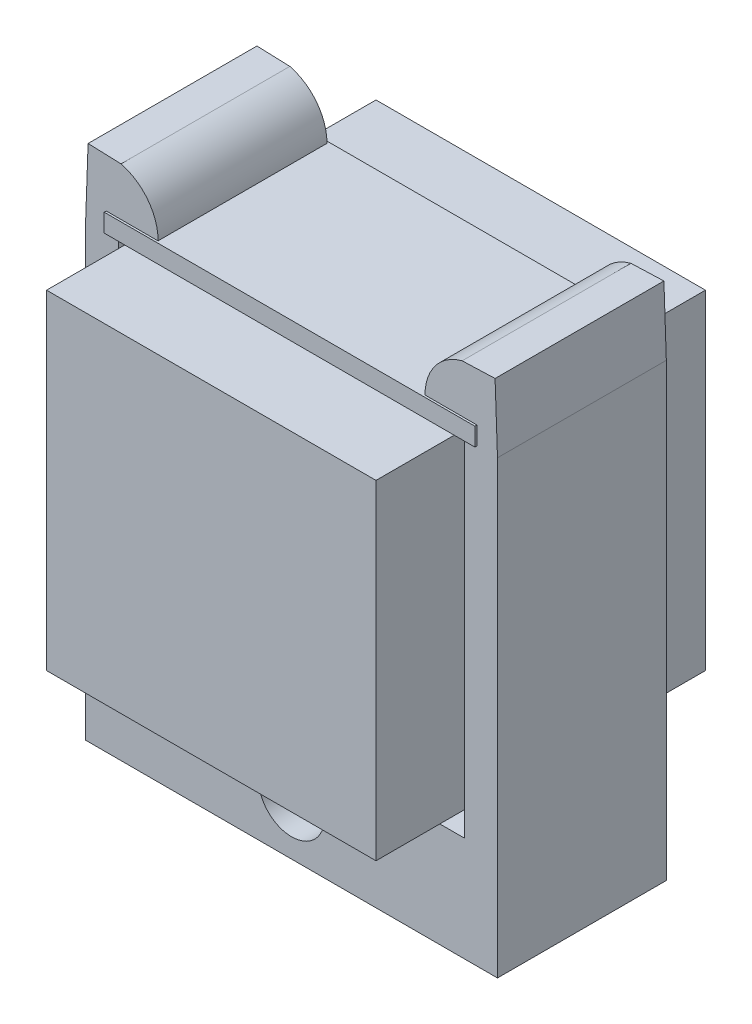
ISO-10303-21;
HEADER;
FILE_DESCRIPTION(('STEP AP214'),'2;1');
FILE_NAME('part.step','',(''),(''),'','','');
FILE_SCHEMA(('AUTOMOTIVE_DESIGN { 1 0 10303 214 1 1 1 1 }'));
ENDSEC;
DATA;
#1=APPLICATION_CONTEXT('core data for automotive mechanical design processes');
#2=APPLICATION_PROTOCOL_DEFINITION('international standard','automotive_design',2000,#1);
#3=PRODUCT_CONTEXT('',#1,'mechanical');
#4=PRODUCT('Part','Part','',(#3));
#5=PRODUCT_RELATED_PRODUCT_CATEGORY('part','',(#4));
#6=PRODUCT_DEFINITION_FORMATION('','',#4);
#7=PRODUCT_DEFINITION_CONTEXT('part definition',#1,'design');
#8=PRODUCT_DEFINITION('design','',#6,#7);
#9=PRODUCT_DEFINITION_SHAPE('','',#8);
#10=(LENGTH_UNIT() NAMED_UNIT(*) SI_UNIT(.MILLI.,.METRE.));
#11=(NAMED_UNIT(*) PLANE_ANGLE_UNIT() SI_UNIT($,.RADIAN.));
#12=(NAMED_UNIT(*) SI_UNIT($,.STERADIAN.) SOLID_ANGLE_UNIT());
#13=UNCERTAINTY_MEASURE_WITH_UNIT(LENGTH_MEASURE(1.E-05),#10,'distance_accuracy_value','');
#14=(GEOMETRIC_REPRESENTATION_CONTEXT(3) GLOBAL_UNCERTAINTY_ASSIGNED_CONTEXT((#13)) GLOBAL_UNIT_ASSIGNED_CONTEXT((#10,
#11,#12)) REPRESENTATION_CONTEXT('',''));
#15=CARTESIAN_POINT('',(0.,0.,0.));
#16=DIRECTION('',(0.,0.,1.));
#17=DIRECTION('',(1.,0.,0.));
#18=AXIS2_PLACEMENT_3D('',#15,#16,#17);
#19=CARTESIAN_POINT('',(-22.2024484903669,2.24434720304654,10.25));
#20=DIRECTION('',(0.,0.,-1.));
#21=DIRECTION('',(-1.,0.,0.));
#22=AXIS2_PLACEMENT_3D('',#19,#20,#21);
#23=CYLINDRICAL_SURFACE('',#22,5.99639103243552);
#24=CARTESIAN_POINT('',(-22.2024484903669,2.24434720304654,-10.25));
#25=DIRECTION('',(0.,0.,1.));
#26=DIRECTION('',(1.,0.,0.));
#27=AXIS2_PLACEMENT_3D('',#24,#25,#26);
#28=CIRCLE('',#27,5.99639103243552);
#29=CARTESIAN_POINT('',(-20.709878032408,8.05200928360027,-10.25));
#30=VERTEX_POINT('',#29);
#31=CARTESIAN_POINT('',(-16.209878032408,2.03032682954803,-10.25));
#32=VERTEX_POINT('',#31);
#33=EDGE_CURVE('E200',#30,#32,#28,.F.);
#34=ORIENTED_EDGE('',*,*,#33,.F.);
#35=DIRECTION('',(0.,0.,-1.));
#36=VECTOR('',#35,1.);
#37=CARTESIAN_POINT('',(-20.709878032408,8.05200928360027,10.25));
#38=LINE('',#37,#36);
#39=CARTESIAN_POINT('',(-20.709878032408,8.05200928360027,10.25));
#40=VERTEX_POINT('',#39);
#41=EDGE_CURVE('E12',#40,#30,#38,.T.);
#42=ORIENTED_EDGE('',*,*,#41,.F.);
#43=CARTESIAN_POINT('',(-22.2024484903669,2.24434720304654,10.25));
#44=DIRECTION('',(0.,0.,1.));
#45=DIRECTION('',(1.,0.,0.));
#46=AXIS2_PLACEMENT_3D('',#43,#44,#45);
#47=CIRCLE('',#46,5.99639103243552);
#48=CARTESIAN_POINT('',(-16.209878032408,2.03032682954803,10.25));
#49=VERTEX_POINT('',#48);
#50=EDGE_CURVE('E243',#40,#49,#47,.F.);
#51=ORIENTED_EDGE('',*,*,#50,.T.);
#52=DIRECTION('',(0.,0.,-1.));
#53=VECTOR('',#52,1.);
#54=CARTESIAN_POINT('',(-16.209878032408,2.03032682954803,10.25));
#55=LINE('',#54,#53);
#56=EDGE_CURVE('E71',#49,#32,#55,.T.);
#57=ORIENTED_EDGE('',*,*,#56,.T.);
#58=EDGE_LOOP('',(#34,#42,#51,#57));
#59=FACE_BOUND('',#58,.T.);
#60=ADVANCED_FACE('F55',(#59),#23,.T.);
#61=CARTESIAN_POINT('',(0.260823416443797,7.30305566042707,10.25));
#62=DIRECTION('',(0.0356915305124088,0.99936285434755,0.));
#63=DIRECTION('',(-0.99936285434755,0.0356915305124088,0.));
#64=AXIS2_PLACEMENT_3D('',#61,#62,#63);
#65=PLANE('',#64);
#66=DIRECTION('',(0.99936285434755,-0.0356915305124088,0.));
#67=VECTOR('',#66,1.);
#68=CARTESIAN_POINT('',(0.260823416443797,7.30305566042707,-10.25));
#69=LINE('',#68,#67);
#70=CARTESIAN_POINT('',(-24.7073294497982,8.19477540564991,-10.25));
#71=VERTEX_POINT('',#70);
#72=EDGE_CURVE('E202',#71,#30,#69,.T.);
#73=ORIENTED_EDGE('',*,*,#72,.F.);
#74=DIRECTION('',(0.,0.,-1.));
#75=VECTOR('',#74,1.);
#76=CARTESIAN_POINT('',(-24.7073294497982,8.19477540564991,10.25));
#77=LINE('',#76,#75);
#78=CARTESIAN_POINT('',(-24.7073294497982,8.19477540564991,10.25));
#79=VERTEX_POINT('',#78);
#80=EDGE_CURVE('E63',#79,#71,#77,.T.);
#81=ORIENTED_EDGE('',*,*,#80,.F.);
#82=DIRECTION('',(0.99936285434755,-0.0356915305124088,0.));
#83=VECTOR('',#82,1.);
#84=CARTESIAN_POINT('',(0.260823416443797,7.30305566042707,10.25));
#85=LINE('',#84,#83);
#86=EDGE_CURVE('E294',#79,#40,#85,.T.);
#87=ORIENTED_EDGE('',*,*,#86,.T.);
#88=ORIENTED_EDGE('',*,*,#41,.T.);
#89=EDGE_LOOP('',(#73,#81,#87,#88));
#90=FACE_BOUND('',#89,.T.);
#91=ADVANCED_FACE('F280',(#90),#65,.T.);
#92=CARTESIAN_POINT('',(-24.968152866242,0.891719745222844,10.25));
#93=DIRECTION('',(-0.99936285434755,0.035691530512409,0.));
#94=DIRECTION('',(-0.035691530512409,-0.99936285434755,0.));
#95=AXIS2_PLACEMENT_3D('',#92,#93,#94);
#96=PLANE('',#95);
#97=DIRECTION('',(0.035691530512409,0.99936285434755,0.));
#98=VECTOR('',#97,1.);
#99=CARTESIAN_POINT('',(-24.968152866242,0.891719745222844,-10.25));
#100=LINE('',#99,#98);
#101=CARTESIAN_POINT('',(-25.,0.,-10.25));
#102=VERTEX_POINT('',#101);
#103=EDGE_CURVE('E205',#102,#71,#100,.T.);
#104=ORIENTED_EDGE('',*,*,#103,.F.);
#105=DIRECTION('',(0.,0.,-1.));
#106=VECTOR('',#105,1.);
#107=CARTESIAN_POINT('',(-25.,0.,10.25));
#108=LINE('',#107,#106);
#109=CARTESIAN_POINT('',(-25.,0.,10.25));
#110=VERTEX_POINT('',#109);
#111=EDGE_CURVE('E269',#110,#102,#108,.T.);
#112=ORIENTED_EDGE('',*,*,#111,.F.);
#113=DIRECTION('',(0.035691530512409,0.99936285434755,0.));
#114=VECTOR('',#113,1.);
#115=CARTESIAN_POINT('',(-24.968152866242,0.891719745222844,10.25));
#116=LINE('',#115,#114);
#117=EDGE_CURVE('E276',#110,#79,#116,.T.);
#118=ORIENTED_EDGE('',*,*,#117,.T.);
#119=ORIENTED_EDGE('',*,*,#80,.T.);
#120=EDGE_LOOP('',(#104,#112,#118,#119));
#121=FACE_BOUND('',#120,.T.);
#122=ADVANCED_FACE('F274',(#121),#96,.T.);
#123=CARTESIAN_POINT('',(-25.,0.,10.25));
#124=DIRECTION('',(-1.,0.,0.));
#125=DIRECTION('',(0.,0.,1.));
#126=AXIS2_PLACEMENT_3D('',#123,#124,#125);
#127=PLANE('',#126);
#128=DIRECTION('',(0.,1.,0.));
#129=VECTOR('',#128,1.);
#130=CARTESIAN_POINT('',(-25.,0.,-10.25));
#131=LINE('',#130,#129);
#132=CARTESIAN_POINT('',(-25.,-54.7,-10.25));
#133=VERTEX_POINT('',#132);
#134=EDGE_CURVE('E208',#133,#102,#131,.T.);
#135=ORIENTED_EDGE('',*,*,#134,.F.);
#136=DIRECTION('',(0.,0.,-1.));
#137=VECTOR('',#136,1.);
#138=CARTESIAN_POINT('',(-25.,-54.7,10.25));
#139=LINE('',#138,#137);
#140=CARTESIAN_POINT('',(-25.,-54.7,10.25));
#141=VERTEX_POINT('',#140);
#142=EDGE_CURVE('E267',#141,#133,#139,.T.);
#143=ORIENTED_EDGE('',*,*,#142,.F.);
#144=DIRECTION('',(0.,1.,0.));
#145=VECTOR('',#144,1.);
#146=CARTESIAN_POINT('',(-25.,0.,10.25));
#147=LINE('',#146,#145);
#148=EDGE_CURVE('E291',#141,#110,#147,.T.);
#149=ORIENTED_EDGE('',*,*,#148,.T.);
#150=ORIENTED_EDGE('',*,*,#111,.T.);
#151=EDGE_LOOP('',(#135,#143,#149,#150));
#152=FACE_BOUND('',#151,.T.);
#153=ADVANCED_FACE('F288',(#152),#127,.T.);
#154=CARTESIAN_POINT('',(0.,-54.7,10.25));
#155=DIRECTION('',(0.,-1.,0.));
#156=DIRECTION('',(0.,0.,-1.));
#157=AXIS2_PLACEMENT_3D('',#154,#155,#156);
#158=PLANE('',#157);
#159=DIRECTION('',(-1.,0.,0.));
#160=VECTOR('',#159,1.);
#161=CARTESIAN_POINT('',(0.,-54.7,-10.25));
#162=LINE('',#161,#160);
#163=CARTESIAN_POINT('',(25.,-54.7,-10.25));
#164=VERTEX_POINT('',#163);
#165=EDGE_CURVE('E211',#164,#133,#162,.T.);
#166=ORIENTED_EDGE('',*,*,#165,.F.);
#167=DIRECTION('',(0.,0.,-1.));
#168=VECTOR('',#167,1.);
#169=CARTESIAN_POINT('',(25.,-54.7,10.25));
#170=LINE('',#169,#168);
#171=CARTESIAN_POINT('',(25.,-54.7,10.25));
#172=VERTEX_POINT('',#171);
#173=EDGE_CURVE('E265',#172,#164,#170,.T.);
#174=ORIENTED_EDGE('',*,*,#173,.F.);
#175=DIRECTION('',(-1.,0.,0.));
#176=VECTOR('',#175,1.);
#177=CARTESIAN_POINT('',(0.,-54.7,10.25));
#178=LINE('',#177,#176);
#179=EDGE_CURVE('E296',#172,#141,#178,.T.);
#180=ORIENTED_EDGE('',*,*,#179,.T.);
#181=ORIENTED_EDGE('',*,*,#142,.T.);
#182=EDGE_LOOP('',(#166,#174,#180,#181));
#183=FACE_BOUND('',#182,.T.);
#184=ADVANCED_FACE('F343',(#183),#158,.T.);
#185=CARTESIAN_POINT('',(25.,0.,10.25));
#186=DIRECTION('',(-1.,0.,0.));
#187=DIRECTION('',(0.,0.,1.));
#188=AXIS2_PLACEMENT_3D('',#185,#186,#187);
#189=PLANE('',#188);
#190=DIRECTION('',(0.,1.,0.));
#191=VECTOR('',#190,1.);
#192=CARTESIAN_POINT('',(25.,0.,-10.25));
#193=LINE('',#192,#191);
#194=CARTESIAN_POINT('',(25.,0.,-10.25));
#195=VERTEX_POINT('',#194);
#196=EDGE_CURVE('E214',#164,#195,#193,.T.);
#197=ORIENTED_EDGE('',*,*,#196,.T.);
#198=DIRECTION('',(0.,0.,-1.));
#199=VECTOR('',#198,1.);
#200=CARTESIAN_POINT('',(25.,0.,10.25));
#201=LINE('',#200,#199);
#202=CARTESIAN_POINT('',(25.,0.,10.25));
#203=VERTEX_POINT('',#202);
#204=EDGE_CURVE('E262',#203,#195,#201,.T.);
#205=ORIENTED_EDGE('',*,*,#204,.F.);
#206=DIRECTION('',(0.,1.,0.));
#207=VECTOR('',#206,1.);
#208=CARTESIAN_POINT('',(25.,0.,10.25));
#209=LINE('',#208,#207);
#210=EDGE_CURVE('E302',#172,#203,#209,.T.);
#211=ORIENTED_EDGE('',*,*,#210,.F.);
#212=ORIENTED_EDGE('',*,*,#173,.T.);
#213=EDGE_LOOP('',(#197,#205,#211,#212));
#214=FACE_BOUND('',#213,.T.);
#215=ADVANCED_FACE('F346',(#214),#189,.F.);
#216=CARTESIAN_POINT('',(24.968152866242,0.891719745222844,10.25));
#217=DIRECTION('',(-0.99936285434755,-0.035691530512409,0.));
#218=DIRECTION('',(0.035691530512409,-0.99936285434755,0.));
#219=AXIS2_PLACEMENT_3D('',#216,#217,#218);
#220=PLANE('',#219);
#221=DIRECTION('',(-0.035691530512409,0.99936285434755,0.));
#222=VECTOR('',#221,1.);
#223=CARTESIAN_POINT('',(24.968152866242,0.891719745222844,-10.25));
#224=LINE('',#223,#222);
#225=CARTESIAN_POINT('',(24.7073294497982,8.19477540564991,-10.25));
#226=VERTEX_POINT('',#225);
#227=EDGE_CURVE('E216',#195,#226,#224,.T.);
#228=ORIENTED_EDGE('',*,*,#227,.T.);
#229=DIRECTION('',(0.,0.,-1.));
#230=VECTOR('',#229,1.);
#231=CARTESIAN_POINT('',(24.7073294497982,8.19477540564991,10.25));
#232=LINE('',#231,#230);
#233=CARTESIAN_POINT('',(24.7073294497982,8.19477540564991,10.25));
#234=VERTEX_POINT('',#233);
#235=EDGE_CURVE('E259',#234,#226,#232,.T.);
#236=ORIENTED_EDGE('',*,*,#235,.F.);
#237=DIRECTION('',(-0.035691530512409,0.99936285434755,0.));
#238=VECTOR('',#237,1.);
#239=CARTESIAN_POINT('',(24.968152866242,0.891719745222844,10.25));
#240=LINE('',#239,#238);
#241=EDGE_CURVE('E304',#203,#234,#240,.T.);
#242=ORIENTED_EDGE('',*,*,#241,.F.);
#243=ORIENTED_EDGE('',*,*,#204,.T.);
#244=EDGE_LOOP('',(#228,#236,#242,#243));
#245=FACE_BOUND('',#244,.T.);
#246=ADVANCED_FACE('F350',(#245),#220,.F.);
#247=CARTESIAN_POINT('',(-0.260823416443797,7.30305566042707,10.25));
#248=DIRECTION('',(0.0356915305124088,-0.99936285434755,0.));
#249=DIRECTION('',(0.99936285434755,0.0356915305124088,0.));
#250=AXIS2_PLACEMENT_3D('',#247,#248,#249);
#251=PLANE('',#250);
#252=DIRECTION('',(-0.99936285434755,-0.0356915305124088,0.));
#253=VECTOR('',#252,1.);
#254=CARTESIAN_POINT('',(-0.260823416443797,7.30305566042707,-10.25));
#255=LINE('',#254,#253);
#256=CARTESIAN_POINT('',(20.709878032408,8.05200928360027,-10.25));
#257=VERTEX_POINT('',#256);
#258=EDGE_CURVE('E218',#226,#257,#255,.T.);
#259=ORIENTED_EDGE('',*,*,#258,.T.);
#260=DIRECTION('',(0.,0.,-1.));
#261=VECTOR('',#260,1.);
#262=CARTESIAN_POINT('',(20.709878032408,8.05200928360027,10.25));
#263=LINE('',#262,#261);
#264=CARTESIAN_POINT('',(20.709878032408,8.05200928360027,10.25));
#265=VERTEX_POINT('',#264);
#266=EDGE_CURVE('E256',#265,#257,#263,.T.);
#267=ORIENTED_EDGE('',*,*,#266,.F.);
#268=DIRECTION('',(-0.99936285434755,-0.0356915305124088,0.));
#269=VECTOR('',#268,1.);
#270=CARTESIAN_POINT('',(-0.260823416443797,7.30305566042707,10.25));
#271=LINE('',#270,#269);
#272=EDGE_CURVE('E306',#234,#265,#271,.T.);
#273=ORIENTED_EDGE('',*,*,#272,.F.);
#274=ORIENTED_EDGE('',*,*,#235,.T.);
#275=EDGE_LOOP('',(#259,#267,#273,#274));
#276=FACE_BOUND('',#275,.T.);
#277=ADVANCED_FACE('F354',(#276),#251,.F.);
#278=CARTESIAN_POINT('',(22.2024484903669,2.24434720304654,10.25));
#279=DIRECTION('',(0.,0.,-1.));
#280=DIRECTION('',(-1.,0.,0.));
#281=AXIS2_PLACEMENT_3D('',#278,#279,#280);
#282=CYLINDRICAL_SURFACE('',#281,5.99639103243552);
#283=CARTESIAN_POINT('',(22.2024484903669,2.24434720304654,-10.25));
#284=DIRECTION('',(0.,0.,1.));
#285=DIRECTION('',(1.,0.,0.));
#286=AXIS2_PLACEMENT_3D('',#283,#284,#285);
#287=CIRCLE('',#286,5.99639103243552);
#288=CARTESIAN_POINT('',(16.209878032408,2.03032682954803,-10.25));
#289=VERTEX_POINT('',#288);
#290=EDGE_CURVE('E220',#257,#289,#287,.T.);
#291=ORIENTED_EDGE('',*,*,#290,.T.);
#292=DIRECTION('',(0.,0.,-1.));
#293=VECTOR('',#292,1.);
#294=CARTESIAN_POINT('',(16.209878032408,2.03032682954803,10.25));
#295=LINE('',#294,#293);
#296=CARTESIAN_POINT('',(16.209878032408,2.03032682954803,10.25));
#297=VERTEX_POINT('',#296);
#298=EDGE_CURVE('E253',#297,#289,#295,.T.);
#299=ORIENTED_EDGE('',*,*,#298,.F.);
#300=CARTESIAN_POINT('',(22.2024484903669,2.24434720304654,10.25));
#301=DIRECTION('',(0.,0.,1.));
#302=DIRECTION('',(1.,0.,0.));
#303=AXIS2_PLACEMENT_3D('',#300,#301,#302);
#304=CIRCLE('',#303,5.99639103243552);
#305=EDGE_CURVE('E308',#265,#297,#304,.T.);
#306=ORIENTED_EDGE('',*,*,#305,.F.);
#307=ORIENTED_EDGE('',*,*,#266,.T.);
#308=EDGE_LOOP('',(#291,#299,#306,#307));
#309=FACE_BOUND('',#308,.T.);
#310=ADVANCED_FACE('F358',(#309),#282,.T.);
#311=CARTESIAN_POINT('',(-0.0517697747706174,1.44955369357741,10.25));
#312=DIRECTION('',(-0.0356915305124094,0.99936285434755,0.));
#313=DIRECTION('',(-0.99936285434755,-0.0356915305124094,0.));
#314=AXIS2_PLACEMENT_3D('',#311,#312,#313);
#315=PLANE('',#314);
#316=DIRECTION('',(0.99936285434755,0.0356915305124094,0.));
#317=VECTOR('',#316,1.);
#318=CARTESIAN_POINT('',(-0.0517697747706174,1.44955369357741,-10.25));
#319=LINE('',#318,#317);
#320=CARTESIAN_POINT('',(20.9214786328727,2.19859827956461,-10.25));
#321=VERTEX_POINT('',#320);
#322=EDGE_CURVE('E222',#289,#321,#319,.T.);
#323=ORIENTED_EDGE('',*,*,#322,.T.);
#324=DIRECTION('',(0.,0.,-1.));
#325=VECTOR('',#324,1.);
#326=CARTESIAN_POINT('',(20.9214786328727,2.19859827956461,10.25));
#327=LINE('',#326,#325);
#328=CARTESIAN_POINT('',(20.9214786328727,2.19859827956461,10.25));
#329=VERTEX_POINT('',#328);
#330=EDGE_CURVE('E251',#329,#321,#327,.T.);
#331=ORIENTED_EDGE('',*,*,#330,.F.);
#332=DIRECTION('',(0.99936285434755,0.0356915305124094,0.));
#333=VECTOR('',#332,1.);
#334=CARTESIAN_POINT('',(-0.0517697747706174,1.44955369357741,10.25));
#335=LINE('',#334,#333);
#336=EDGE_CURVE('E310',#297,#329,#335,.T.);
#337=ORIENTED_EDGE('',*,*,#336,.F.);
#338=ORIENTED_EDGE('',*,*,#298,.T.);
#339=EDGE_LOOP('',(#323,#331,#337,#338));
#340=FACE_BOUND('',#339,.T.);
#341=ADVANCED_FACE('F362',(#340),#315,.F.);
#342=CARTESIAN_POINT('',(20.9732484076433,0.749044585987146,10.25));
#343=DIRECTION('',(-0.99936285434755,-0.035691530512407,0.));
#344=DIRECTION('',(0.035691530512407,-0.99936285434755,0.));
#345=AXIS2_PLACEMENT_3D('',#342,#343,#344);
#346=PLANE('',#345);
#347=DIRECTION('',(-0.035691530512407,0.99936285434755,0.));
#348=VECTOR('',#347,1.);
#349=CARTESIAN_POINT('',(20.9732484076433,0.749044585987146,-10.25));
#350=LINE('',#349,#348);
#351=CARTESIAN_POINT('',(21.,0.,-10.25));
#352=VERTEX_POINT('',#351);
#353=EDGE_CURVE('E225',#352,#321,#350,.T.);
#354=ORIENTED_EDGE('',*,*,#353,.F.);
#355=DIRECTION('',(0.,0.,-1.));
#356=VECTOR('',#355,1.);
#357=CARTESIAN_POINT('',(21.,0.,10.25));
#358=LINE('',#357,#356);
#359=CARTESIAN_POINT('',(21.,0.,10.25));
#360=VERTEX_POINT('',#359);
#361=EDGE_CURVE('E249',#360,#352,#358,.T.);
#362=ORIENTED_EDGE('',*,*,#361,.F.);
#363=DIRECTION('',(-0.035691530512407,0.99936285434755,0.));
#364=VECTOR('',#363,1.);
#365=CARTESIAN_POINT('',(20.9732484076433,0.749044585987146,10.25));
#366=LINE('',#365,#364);
#367=EDGE_CURVE('E312',#360,#329,#366,.T.);
#368=ORIENTED_EDGE('',*,*,#367,.T.);
#369=ORIENTED_EDGE('',*,*,#330,.T.);
#370=EDGE_LOOP('',(#354,#362,#368,#369));
#371=FACE_BOUND('',#370,.T.);
#372=ADVANCED_FACE('F366',(#371),#346,.T.);
#373=CARTESIAN_POINT('',(21.,0.,10.25));
#374=DIRECTION('',(-1.,0.,0.));
#375=DIRECTION('',(0.,0.,1.));
#376=AXIS2_PLACEMENT_3D('',#373,#374,#375);
#377=PLANE('',#376);
#378=DIRECTION('',(0.,1.,0.));
#379=VECTOR('',#378,1.);
#380=CARTESIAN_POINT('',(21.,0.,-10.25));
#381=LINE('',#380,#379);
#382=CARTESIAN_POINT('',(21.,-42.,-10.25));
#383=VERTEX_POINT('',#382);
#384=EDGE_CURVE('E228',#383,#352,#381,.T.);
#385=ORIENTED_EDGE('',*,*,#384,.F.);
#386=DIRECTION('',(0.,0.,-1.));
#387=VECTOR('',#386,1.);
#388=CARTESIAN_POINT('',(21.,-42.,10.25));
#389=LINE('',#388,#387);
#390=CARTESIAN_POINT('',(21.,-42.,10.25));
#391=VERTEX_POINT('',#390);
#392=EDGE_CURVE('E247',#391,#383,#389,.T.);
#393=ORIENTED_EDGE('',*,*,#392,.F.);
#394=DIRECTION('',(0.,1.,0.));
#395=VECTOR('',#394,1.);
#396=CARTESIAN_POINT('',(21.,0.,10.25));
#397=LINE('',#396,#395);
#398=EDGE_CURVE('E315',#391,#360,#397,.T.);
#399=ORIENTED_EDGE('',*,*,#398,.T.);
#400=ORIENTED_EDGE('',*,*,#361,.T.);
#401=EDGE_LOOP('',(#385,#393,#399,#400));
#402=FACE_BOUND('',#401,.T.);
#403=ADVANCED_FACE('F370',(#402),#377,.T.);
#404=CARTESIAN_POINT('',(0.,-42.,10.25));
#405=DIRECTION('',(0.,1.,0.));
#406=DIRECTION('',(0.,0.,1.));
#407=AXIS2_PLACEMENT_3D('',#404,#405,#406);
#408=PLANE('',#407);
#409=DIRECTION('',(1.,0.,0.));
#410=VECTOR('',#409,1.);
#411=CARTESIAN_POINT('',(0.,-42.,-10.25));
#412=LINE('',#411,#410);
#413=CARTESIAN_POINT('',(-21.,-42.,-10.25));
#414=VERTEX_POINT('',#413);
#415=EDGE_CURVE('E231',#414,#383,#412,.T.);
#416=ORIENTED_EDGE('',*,*,#415,.F.);
#417=DIRECTION('',(0.,0.,-1.));
#418=VECTOR('',#417,1.);
#419=CARTESIAN_POINT('',(-21.,-42.,10.25));
#420=LINE('',#419,#418);
#421=CARTESIAN_POINT('',(-21.,-42.,10.25));
#422=VERTEX_POINT('',#421);
#423=EDGE_CURVE('E189',#422,#414,#420,.T.);
#424=ORIENTED_EDGE('',*,*,#423,.F.);
#425=DIRECTION('',(1.,0.,0.));
#426=VECTOR('',#425,1.);
#427=CARTESIAN_POINT('',(0.,-42.,10.25));
#428=LINE('',#427,#426);
#429=EDGE_CURVE('E179',#422,#391,#428,.T.);
#430=ORIENTED_EDGE('',*,*,#429,.T.);
#431=ORIENTED_EDGE('',*,*,#392,.T.);
#432=EDGE_LOOP('',(#416,#424,#430,#431));
#433=FACE_BOUND('',#432,.T.);
#434=ADVANCED_FACE('F319',(#433),#408,.T.);
#435=CARTESIAN_POINT('',(-21.,0.,10.25));
#436=DIRECTION('',(-1.,0.,0.));
#437=DIRECTION('',(0.,0.,1.));
#438=AXIS2_PLACEMENT_3D('',#435,#436,#437);
#439=PLANE('',#438);
#440=DIRECTION('',(0.,1.,0.));
#441=VECTOR('',#440,1.);
#442=CARTESIAN_POINT('',(-21.,0.,-10.25));
#443=LINE('',#442,#441);
#444=CARTESIAN_POINT('',(-21.,0.,-10.25));
#445=VERTEX_POINT('',#444);
#446=EDGE_CURVE('E186',#414,#445,#443,.T.);
#447=ORIENTED_EDGE('',*,*,#446,.T.);
#448=DIRECTION('',(0.,0.,-1.));
#449=VECTOR('',#448,1.);
#450=CARTESIAN_POINT('',(-21.,0.,10.25));
#451=LINE('',#450,#449);
#452=CARTESIAN_POINT('',(-21.,0.,10.25));
#453=VERTEX_POINT('',#452);
#454=EDGE_CURVE('E183',#453,#445,#451,.T.);
#455=ORIENTED_EDGE('',*,*,#454,.F.);
#456=DIRECTION('',(0.,1.,0.));
#457=VECTOR('',#456,1.);
#458=CARTESIAN_POINT('',(-21.,0.,10.25));
#459=LINE('',#458,#457);
#460=EDGE_CURVE('E170',#422,#453,#459,.T.);
#461=ORIENTED_EDGE('',*,*,#460,.F.);
#462=ORIENTED_EDGE('',*,*,#423,.T.);
#463=EDGE_LOOP('',(#447,#455,#461,#462));
#464=FACE_BOUND('',#463,.T.);
#465=ADVANCED_FACE('F184',(#464),#439,.F.);
#466=CARTESIAN_POINT('',(-20.9732484076433,0.749044585987146,10.25));
#467=DIRECTION('',(-0.99936285434755,0.035691530512407,0.));
#468=DIRECTION('',(-0.035691530512407,-0.99936285434755,0.));
#469=AXIS2_PLACEMENT_3D('',#466,#467,#468);
#470=PLANE('',#469);
#471=DIRECTION('',(0.035691530512407,0.99936285434755,0.));
#472=VECTOR('',#471,1.);
#473=CARTESIAN_POINT('',(-20.9732484076433,0.749044585987146,-10.25));
#474=LINE('',#473,#472);
#475=CARTESIAN_POINT('',(-20.9214786328727,2.19859827956461,-10.25));
#476=VERTEX_POINT('',#475);
#477=EDGE_CURVE('E235',#445,#476,#474,.T.);
#478=ORIENTED_EDGE('',*,*,#477,.T.);
#479=DIRECTION('',(0.,0.,-1.));
#480=VECTOR('',#479,1.);
#481=CARTESIAN_POINT('',(-20.9214786328727,2.19859827956461,10.25));
#482=LINE('',#481,#480);
#483=CARTESIAN_POINT('',(-20.9214786328727,2.19859827956461,10.25));
#484=VERTEX_POINT('',#483);
#485=EDGE_CURVE('E121',#484,#476,#482,.T.);
#486=ORIENTED_EDGE('',*,*,#485,.F.);
#487=DIRECTION('',(0.035691530512407,0.99936285434755,0.));
#488=VECTOR('',#487,1.);
#489=CARTESIAN_POINT('',(-20.9732484076433,0.749044585987146,10.25));
#490=LINE('',#489,#488);
#491=EDGE_CURVE('E176',#453,#484,#490,.T.);
#492=ORIENTED_EDGE('',*,*,#491,.F.);
#493=ORIENTED_EDGE('',*,*,#454,.T.);
#494=EDGE_LOOP('',(#478,#486,#492,#493));
#495=FACE_BOUND('',#494,.T.);
#496=ADVANCED_FACE('F191',(#495),#470,.F.);
#497=CARTESIAN_POINT('',(0.0517697747706174,1.44955369357741,10.25));
#498=DIRECTION('',(-0.0356915305124094,-0.99936285434755,0.));
#499=DIRECTION('',(0.99936285434755,-0.0356915305124094,0.));
#500=AXIS2_PLACEMENT_3D('',#497,#498,#499);
#501=PLANE('',#500);
#502=DIRECTION('',(-0.99936285434755,0.0356915305124094,0.));
#503=VECTOR('',#502,1.);
#504=CARTESIAN_POINT('',(0.0517697747706174,1.44955369357741,-10.25));
#505=LINE('',#504,#503);
#506=EDGE_CURVE('E237',#32,#476,#505,.T.);
#507=ORIENTED_EDGE('',*,*,#506,.F.);
#508=ORIENTED_EDGE('',*,*,#56,.F.);
#509=DIRECTION('',(-0.99936285434755,0.0356915305124094,0.));
#510=VECTOR('',#509,1.);
#511=CARTESIAN_POINT('',(0.0517697747706174,1.44955369357741,10.25));
#512=LINE('',#511,#510);
#513=EDGE_CURVE('E192',#49,#484,#512,.T.);
#514=ORIENTED_EDGE('',*,*,#513,.T.);
#515=ORIENTED_EDGE('',*,*,#485,.T.);
#516=EDGE_LOOP('',(#507,#508,#514,#515));
#517=FACE_BOUND('',#516,.T.);
#518=ADVANCED_FACE('F321',(#517),#501,.T.);
#519=CARTESIAN_POINT('',(0.,-48.35,10.25));
#520=DIRECTION('',(0.,0.,-1.));
#521=DIRECTION('',(-1.,0.,0.));
#522=AXIS2_PLACEMENT_3D('',#519,#520,#521);
#523=CYLINDRICAL_SURFACE('',#522,4.);
#524=CARTESIAN_POINT('',(0.,-48.35,10.25));
#525=DIRECTION('',(0.,0.,1.));
#526=DIRECTION('',(1.,0.,0.));
#527=AXIS2_PLACEMENT_3D('',#524,#525,#526);
#528=CIRCLE('',#527,4.);
#529=CARTESIAN_POINT('',(4.,-48.35,10.25));
#530=VERTEX_POINT('',#529);
#531=EDGE_CURVE('E194',#530,#530,#528,.T.);
#532=ORIENTED_EDGE('',*,*,#531,.T.);
#533=EDGE_LOOP('',(#532));
#534=FACE_BOUND('',#533,.T.);
#535=CARTESIAN_POINT('',(0.,-48.35,-10.25));
#536=DIRECTION('',(0.,0.,1.));
#537=DIRECTION('',(1.,0.,0.));
#538=AXIS2_PLACEMENT_3D('',#535,#536,#537);
#539=CIRCLE('',#538,4.);
#540=CARTESIAN_POINT('',(4.,-48.35,-10.25));
#541=VERTEX_POINT('',#540);
#542=EDGE_CURVE('E240',#541,#541,#539,.T.);
#543=ORIENTED_EDGE('',*,*,#542,.F.);
#544=EDGE_LOOP('',(#543));
#545=FACE_BOUND('',#544,.T.);
#546=ADVANCED_FACE('F323',(#534,#545),#523,.F.);
#547=CARTESIAN_POINT('',(0.,0.,10.25));
#548=DIRECTION('',(0.,0.,1.));
#549=DIRECTION('',(1.,0.,0.));
#550=AXIS2_PLACEMENT_3D('',#547,#548,#549);
#551=PLANE('',#550);
#552=ORIENTED_EDGE('',*,*,#50,.F.);
#553=ORIENTED_EDGE('',*,*,#86,.F.);
#554=ORIENTED_EDGE('',*,*,#117,.F.);
#555=ORIENTED_EDGE('',*,*,#148,.F.);
#556=ORIENTED_EDGE('',*,*,#179,.F.);
#557=ORIENTED_EDGE('',*,*,#210,.T.);
#558=ORIENTED_EDGE('',*,*,#241,.T.);
#559=ORIENTED_EDGE('',*,*,#272,.T.);
#560=ORIENTED_EDGE('',*,*,#305,.T.);
#561=ORIENTED_EDGE('',*,*,#336,.T.);
#562=ORIENTED_EDGE('',*,*,#367,.F.);
#563=ORIENTED_EDGE('',*,*,#398,.F.);
#564=ORIENTED_EDGE('',*,*,#429,.F.);
#565=ORIENTED_EDGE('',*,*,#460,.T.);
#566=ORIENTED_EDGE('',*,*,#491,.T.);
#567=ORIENTED_EDGE('',*,*,#513,.F.);
#568=EDGE_LOOP('',(#552,#553,#554,#555,#556,#557,#558,#559,#560,#561,#562,#563,#564,#565,#566,#567));
#569=FACE_BOUND('',#568,.T.);
#570=ORIENTED_EDGE('',*,*,#531,.F.);
#571=EDGE_LOOP('',(#570));
#572=FACE_BOUND('',#571,.T.);
#573=ADVANCED_FACE('F172',(#569,#572),#551,.T.);
#574=CARTESIAN_POINT('',(0.,0.,-10.25));
#575=DIRECTION('',(0.,0.,1.));
#576=DIRECTION('',(1.,0.,0.));
#577=AXIS2_PLACEMENT_3D('',#574,#575,#576);
#578=PLANE('',#577);
#579=ORIENTED_EDGE('',*,*,#33,.T.);
#580=ORIENTED_EDGE('',*,*,#506,.T.);
#581=ORIENTED_EDGE('',*,*,#477,.F.);
#582=ORIENTED_EDGE('',*,*,#446,.F.);
#583=ORIENTED_EDGE('',*,*,#415,.T.);
#584=ORIENTED_EDGE('',*,*,#384,.T.);
#585=ORIENTED_EDGE('',*,*,#353,.T.);
#586=ORIENTED_EDGE('',*,*,#322,.F.);
#587=ORIENTED_EDGE('',*,*,#290,.F.);
#588=ORIENTED_EDGE('',*,*,#258,.F.);
#589=ORIENTED_EDGE('',*,*,#227,.F.);
#590=ORIENTED_EDGE('',*,*,#196,.F.);
#591=ORIENTED_EDGE('',*,*,#165,.T.);
#592=ORIENTED_EDGE('',*,*,#134,.T.);
#593=ORIENTED_EDGE('',*,*,#103,.T.);
#594=ORIENTED_EDGE('',*,*,#72,.T.);
#595=EDGE_LOOP('',(#579,#580,#581,#582,#583,#584,#585,#586,#587,#588,#589,#590,#591,#592,#593,#594));
#596=FACE_BOUND('',#595,.T.);
#597=ORIENTED_EDGE('',*,*,#542,.T.);
#598=EDGE_LOOP('',(#597));
#599=FACE_BOUND('',#598,.T.);
#600=ADVANCED_FACE('F282',(#596,#599),#578,.F.);
#601=CLOSED_SHELL('',(#60,#91,#122,#153,#184,#215,#246,#277,#310,#341,#372,#403,#434,#465,#496,
#518,#546,#573,#600));
#602=MANIFOLD_SOLID_BREP('B2',#601);
#603=CARTESIAN_POINT('',(20.,-40.,20.));
#604=DIRECTION('',(1.,0.,0.));
#605=DIRECTION('',(0.,0.,-1.));
#606=AXIS2_PLACEMENT_3D('',#603,#604,#605);
#607=PLANE('',#606);
#608=DIRECTION('',(0.,0.,-1.));
#609=VECTOR('',#608,1.);
#610=CARTESIAN_POINT('',(20.,0.,20.));
#611=LINE('',#610,#609);
#612=CARTESIAN_POINT('',(20.,0.,20.));
#613=VERTEX_POINT('',#612);
#614=CARTESIAN_POINT('',(20.,0.,-20.));
#615=VERTEX_POINT('',#614);
#616=EDGE_CURVE('E653',#613,#615,#611,.T.);
#617=ORIENTED_EDGE('',*,*,#616,.F.);
#618=DIRECTION('',(0.,1.,0.));
#619=VECTOR('',#618,1.);
#620=CARTESIAN_POINT('',(20.,-40.,20.));
#621=LINE('',#620,#619);
#622=CARTESIAN_POINT('',(20.,-40.,20.));
#623=VERTEX_POINT('',#622);
#624=EDGE_CURVE('E53',#623,#613,#621,.T.);
#625=ORIENTED_EDGE('',*,*,#624,.F.);
#626=DIRECTION('',(0.,0.,-1.));
#627=VECTOR('',#626,1.);
#628=CARTESIAN_POINT('',(20.,-40.,20.));
#629=LINE('',#628,#627);
#630=CARTESIAN_POINT('',(20.,-40.,-20.));
#631=VERTEX_POINT('',#630);
#632=EDGE_CURVE('E645',#623,#631,#629,.T.);
#633=ORIENTED_EDGE('',*,*,#632,.T.);
#634=DIRECTION('',(0.,1.,0.));
#635=VECTOR('',#634,1.);
#636=CARTESIAN_POINT('',(20.,-40.,-20.));
#637=LINE('',#636,#635);
#638=EDGE_CURVE('E586',#631,#615,#637,.T.);
#639=ORIENTED_EDGE('',*,*,#638,.T.);
#640=EDGE_LOOP('',(#617,#625,#633,#639));
#641=FACE_BOUND('',#640,.T.);
#642=ADVANCED_FACE('F583',(#641),#607,.T.);
#643=CARTESIAN_POINT('',(-20.,-40.,20.));
#644=DIRECTION('',(0.,0.,1.));
#645=DIRECTION('',(1.,0.,0.));
#646=AXIS2_PLACEMENT_3D('',#643,#644,#645);
#647=PLANE('',#646);
#648=DIRECTION('',(1.,0.,0.));
#649=VECTOR('',#648,1.);
#650=CARTESIAN_POINT('',(-20.,0.,20.));
#651=LINE('',#650,#649);
#652=CARTESIAN_POINT('',(-20.,0.,20.));
#653=VERTEX_POINT('',#652);
#654=EDGE_CURVE('E648',#653,#613,#651,.T.);
#655=ORIENTED_EDGE('',*,*,#654,.F.);
#656=DIRECTION('',(0.,1.,0.));
#657=VECTOR('',#656,1.);
#658=CARTESIAN_POINT('',(-20.,-40.,20.));
#659=LINE('',#658,#657);
#660=CARTESIAN_POINT('',(-20.,-40.,20.));
#661=VERTEX_POINT('',#660);
#662=EDGE_CURVE('E593',#661,#653,#659,.T.);
#663=ORIENTED_EDGE('',*,*,#662,.F.);
#664=DIRECTION('',(1.,0.,0.));
#665=VECTOR('',#664,1.);
#666=CARTESIAN_POINT('',(-20.,-40.,20.));
#667=LINE('',#666,#665);
#668=EDGE_CURVE('E640',#661,#623,#667,.T.);
#669=ORIENTED_EDGE('',*,*,#668,.T.);
#670=ORIENTED_EDGE('',*,*,#624,.T.);
#671=EDGE_LOOP('',(#655,#663,#669,#670));
#672=FACE_BOUND('',#671,.T.);
#673=ADVANCED_FACE('F669',(#672),#647,.T.);
#674=CARTESIAN_POINT('',(-20.,-40.,20.));
#675=DIRECTION('',(-1.,0.,0.));
#676=DIRECTION('',(0.,0.,1.));
#677=AXIS2_PLACEMENT_3D('',#674,#675,#676);
#678=PLANE('',#677);
#679=DIRECTION('',(0.,0.,1.));
#680=VECTOR('',#679,1.);
#681=CARTESIAN_POINT('',(-20.,0.,20.));
#682=LINE('',#681,#680);
#683=CARTESIAN_POINT('',(-20.,0.,-20.));
#684=VERTEX_POINT('',#683);
#685=EDGE_CURVE('E634',#684,#653,#682,.T.);
#686=ORIENTED_EDGE('',*,*,#685,.F.);
#687=DIRECTION('',(0.,1.,0.));
#688=VECTOR('',#687,1.);
#689=CARTESIAN_POINT('',(-20.,-40.,-20.));
#690=LINE('',#689,#688);
#691=CARTESIAN_POINT('',(-20.,-40.,-20.));
#692=VERTEX_POINT('',#691);
#693=EDGE_CURVE('E629',#692,#684,#690,.T.);
#694=ORIENTED_EDGE('',*,*,#693,.F.);
#695=DIRECTION('',(0.,0.,1.));
#696=VECTOR('',#695,1.);
#697=CARTESIAN_POINT('',(-20.,-40.,20.));
#698=LINE('',#697,#696);
#699=EDGE_CURVE('E632',#692,#661,#698,.T.);
#700=ORIENTED_EDGE('',*,*,#699,.T.);
#701=ORIENTED_EDGE('',*,*,#662,.T.);
#702=EDGE_LOOP('',(#686,#694,#700,#701));
#703=FACE_BOUND('',#702,.T.);
#704=ADVANCED_FACE('F631',(#703),#678,.T.);
#705=CARTESIAN_POINT('',(-20.,-40.,-20.));
#706=DIRECTION('',(0.,0.,-1.));
#707=DIRECTION('',(-1.,0.,0.));
#708=AXIS2_PLACEMENT_3D('',#705,#706,#707);
#709=PLANE('',#708);
#710=DIRECTION('',(-1.,0.,0.));
#711=VECTOR('',#710,1.);
#712=CARTESIAN_POINT('',(-20.,0.,-20.));
#713=LINE('',#712,#711);
#714=EDGE_CURVE('E657',#615,#684,#713,.T.);
#715=ORIENTED_EDGE('',*,*,#714,.F.);
#716=ORIENTED_EDGE('',*,*,#638,.F.);
#717=DIRECTION('',(-1.,0.,0.));
#718=VECTOR('',#717,1.);
#719=CARTESIAN_POINT('',(-20.,-40.,-20.));
#720=LINE('',#719,#718);
#721=EDGE_CURVE('E639',#631,#692,#720,.T.);
#722=ORIENTED_EDGE('',*,*,#721,.T.);
#723=ORIENTED_EDGE('',*,*,#693,.T.);
#724=EDGE_LOOP('',(#715,#716,#722,#723));
#725=FACE_BOUND('',#724,.T.);
#726=ADVANCED_FACE('F643',(#725),#709,.T.);
#727=CARTESIAN_POINT('',(0.,-40.,0.));
#728=DIRECTION('',(0.,-1.,0.));
#729=DIRECTION('',(0.,0.,-1.));
#730=AXIS2_PLACEMENT_3D('',#727,#728,#729);
#731=PLANE('',#730);
#732=ORIENTED_EDGE('',*,*,#632,.F.);
#733=ORIENTED_EDGE('',*,*,#668,.F.);
#734=ORIENTED_EDGE('',*,*,#699,.F.);
#735=ORIENTED_EDGE('',*,*,#721,.F.);
#736=EDGE_LOOP('',(#732,#733,#734,#735));
#737=FACE_BOUND('',#736,.T.);
#738=ADVANCED_FACE('F638',(#737),#731,.T.);
#739=CARTESIAN_POINT('',(0.,0.,0.));
#740=DIRECTION('',(0.,-1.,0.));
#741=DIRECTION('',(0.,0.,-1.));
#742=AXIS2_PLACEMENT_3D('',#739,#740,#741);
#743=PLANE('',#742);
#744=ORIENTED_EDGE('',*,*,#616,.T.);
#745=ORIENTED_EDGE('',*,*,#714,.T.);
#746=ORIENTED_EDGE('',*,*,#685,.T.);
#747=ORIENTED_EDGE('',*,*,#654,.T.);
#748=EDGE_LOOP('',(#744,#745,#746,#747));
#749=FACE_BOUND('',#748,.T.);
#750=ADVANCED_FACE('F668',(#749),#743,.F.);
#751=CLOSED_SHELL('',(#642,#673,#704,#726,#738,#750));
#752=MANIFOLD_SOLID_BREP('B6',#751);
#753=CARTESIAN_POINT('',(22.5,2.2,10.5));
#754=DIRECTION('',(-1.,0.,0.));
#755=DIRECTION('',(0.,0.,1.));
#756=AXIS2_PLACEMENT_3D('',#753,#754,#755);
#757=PLANE('',#756);
#758=DIRECTION('',(0.,0.,-1.));
#759=VECTOR('',#758,1.);
#760=CARTESIAN_POINT('',(22.5,0.,10.5));
#761=LINE('',#760,#759);
#762=CARTESIAN_POINT('',(22.5,0.,10.5));
#763=VERTEX_POINT('',#762);
#764=CARTESIAN_POINT('',(22.5,0.,-10.5));
#765=VERTEX_POINT('',#764);
#766=EDGE_CURVE('E793',#763,#765,#761,.T.);
#767=ORIENTED_EDGE('',*,*,#766,.T.);
#768=DIRECTION('',(0.,-1.,0.));
#769=VECTOR('',#768,1.);
#770=CARTESIAN_POINT('',(22.5,2.2,-10.5));
#771=LINE('',#770,#769);
#772=CARTESIAN_POINT('',(22.5,2.2,-10.5));
#773=VERTEX_POINT('',#772);
#774=EDGE_CURVE('E581',#773,#765,#771,.T.);
#775=ORIENTED_EDGE('',*,*,#774,.F.);
#776=DIRECTION('',(0.,0.,-1.));
#777=VECTOR('',#776,1.);
#778=CARTESIAN_POINT('',(22.5,2.2,10.5));
#779=LINE('',#778,#777);
#780=CARTESIAN_POINT('',(22.5,2.2,10.5));
#781=VERTEX_POINT('',#780);
#782=EDGE_CURVE('E781',#781,#773,#779,.T.);
#783=ORIENTED_EDGE('',*,*,#782,.F.);
#784=DIRECTION('',(0.,-1.,0.));
#785=VECTOR('',#784,1.);
#786=CARTESIAN_POINT('',(22.5,2.2,10.5));
#787=LINE('',#786,#785);
#788=EDGE_CURVE('E789',#781,#763,#787,.T.);
#789=ORIENTED_EDGE('',*,*,#788,.T.);
#790=EDGE_LOOP('',(#767,#775,#783,#789));
#791=FACE_BOUND('',#790,.T.);
#792=ADVANCED_FACE('F730',(#791),#757,.F.);
#793=CARTESIAN_POINT('',(-22.5,2.2,-10.5));
#794=DIRECTION('',(0.,0.,1.));
#795=DIRECTION('',(1.,0.,0.));
#796=AXIS2_PLACEMENT_3D('',#793,#794,#795);
#797=PLANE('',#796);
#798=DIRECTION('',(-1.,0.,0.));
#799=VECTOR('',#798,1.);
#800=CARTESIAN_POINT('',(-22.5,0.,-10.5));
#801=LINE('',#800,#799);
#802=CARTESIAN_POINT('',(-22.5,0.,-10.5));
#803=VERTEX_POINT('',#802);
#804=EDGE_CURVE('E785',#765,#803,#801,.T.);
#805=ORIENTED_EDGE('',*,*,#804,.T.);
#806=DIRECTION('',(0.,-1.,0.));
#807=VECTOR('',#806,1.);
#808=CARTESIAN_POINT('',(-22.5,2.2,-10.5));
#809=LINE('',#808,#807);
#810=CARTESIAN_POINT('',(-22.5,2.2,-10.5));
#811=VERTEX_POINT('',#810);
#812=EDGE_CURVE('E738',#811,#803,#809,.T.);
#813=ORIENTED_EDGE('',*,*,#812,.F.);
#814=DIRECTION('',(-1.,0.,0.));
#815=VECTOR('',#814,1.);
#816=CARTESIAN_POINT('',(-22.5,2.2,-10.5));
#817=LINE('',#816,#815);
#818=EDGE_CURVE('E776',#773,#811,#817,.T.);
#819=ORIENTED_EDGE('',*,*,#818,.F.);
#820=ORIENTED_EDGE('',*,*,#774,.T.);
#821=EDGE_LOOP('',(#805,#813,#819,#820));
#822=FACE_BOUND('',#821,.T.);
#823=ADVANCED_FACE('F784',(#822),#797,.F.);
#824=CARTESIAN_POINT('',(-22.5,2.2,10.5));
#825=DIRECTION('',(1.,0.,0.));
#826=DIRECTION('',(0.,0.,-1.));
#827=AXIS2_PLACEMENT_3D('',#824,#825,#826);
#828=PLANE('',#827);
#829=DIRECTION('',(0.,0.,1.));
#830=VECTOR('',#829,1.);
#831=CARTESIAN_POINT('',(-22.5,0.,10.5));
#832=LINE('',#831,#830);
#833=CARTESIAN_POINT('',(-22.5,0.,10.5));
#834=VERTEX_POINT('',#833);
#835=EDGE_CURVE('E763',#803,#834,#832,.T.);
#836=ORIENTED_EDGE('',*,*,#835,.T.);
#837=DIRECTION('',(0.,-1.,0.));
#838=VECTOR('',#837,1.);
#839=CARTESIAN_POINT('',(-22.5,2.2,10.5));
#840=LINE('',#839,#838);
#841=CARTESIAN_POINT('',(-22.5,2.2,10.5));
#842=VERTEX_POINT('',#841);
#843=EDGE_CURVE('E786',#842,#834,#840,.T.);
#844=ORIENTED_EDGE('',*,*,#843,.F.);
#845=DIRECTION('',(0.,0.,1.));
#846=VECTOR('',#845,1.);
#847=CARTESIAN_POINT('',(-22.5,2.2,10.5));
#848=LINE('',#847,#846);
#849=EDGE_CURVE('E779',#811,#842,#848,.T.);
#850=ORIENTED_EDGE('',*,*,#849,.F.);
#851=ORIENTED_EDGE('',*,*,#812,.T.);
#852=EDGE_LOOP('',(#836,#844,#850,#851));
#853=FACE_BOUND('',#852,.T.);
#854=ADVANCED_FACE('F787',(#853),#828,.F.);
#855=CARTESIAN_POINT('',(-22.5,2.2,10.5));
#856=DIRECTION('',(0.,0.,-1.));
#857=DIRECTION('',(-1.,0.,0.));
#858=AXIS2_PLACEMENT_3D('',#855,#856,#857);
#859=PLANE('',#858);
#860=DIRECTION('',(1.,0.,0.));
#861=VECTOR('',#860,1.);
#862=CARTESIAN_POINT('',(-22.5,0.,10.5));
#863=LINE('',#862,#861);
#864=EDGE_CURVE('E769',#834,#763,#863,.T.);
#865=ORIENTED_EDGE('',*,*,#864,.T.);
#866=ORIENTED_EDGE('',*,*,#788,.F.);
#867=DIRECTION('',(1.,0.,0.));
#868=VECTOR('',#867,1.);
#869=CARTESIAN_POINT('',(-22.5,2.2,10.5));
#870=LINE('',#869,#868);
#871=EDGE_CURVE('E746',#842,#781,#870,.T.);
#872=ORIENTED_EDGE('',*,*,#871,.F.);
#873=ORIENTED_EDGE('',*,*,#843,.T.);
#874=EDGE_LOOP('',(#865,#866,#872,#873));
#875=FACE_BOUND('',#874,.T.);
#876=ADVANCED_FACE('F800',(#875),#859,.F.);
#877=CARTESIAN_POINT('',(0.,2.2,0.));
#878=DIRECTION('',(0.,-1.,0.));
#879=DIRECTION('',(0.,0.,-1.));
#880=AXIS2_PLACEMENT_3D('',#877,#878,#879);
#881=PLANE('',#880);
#882=ORIENTED_EDGE('',*,*,#782,.T.);
#883=ORIENTED_EDGE('',*,*,#818,.T.);
#884=ORIENTED_EDGE('',*,*,#849,.T.);
#885=ORIENTED_EDGE('',*,*,#871,.T.);
#886=EDGE_LOOP('',(#882,#883,#884,#885));
#887=FACE_BOUND('',#886,.T.);
#888=ADVANCED_FACE('F777',(#887),#881,.F.);
#889=CARTESIAN_POINT('',(0.,0.,0.));
#890=DIRECTION('',(0.,-1.,0.));
#891=DIRECTION('',(0.,0.,-1.));
#892=AXIS2_PLACEMENT_3D('',#889,#890,#891);
#893=PLANE('',#892);
#894=ORIENTED_EDGE('',*,*,#766,.F.);
#895=ORIENTED_EDGE('',*,*,#864,.F.);
#896=ORIENTED_EDGE('',*,*,#835,.F.);
#897=ORIENTED_EDGE('',*,*,#804,.F.);
#898=EDGE_LOOP('',(#894,#895,#896,#897));
#899=FACE_BOUND('',#898,.T.);
#900=ADVANCED_FACE('F803',(#899),#893,.T.);
#901=CLOSED_SHELL('',(#792,#823,#854,#876,#888,#900));
#902=MANIFOLD_SOLID_BREP('B47',#901);
#903=ADVANCED_BREP_SHAPE_REPRESENTATION('',(#18,#602,#752,#902),#14);
#904=SHAPE_DEFINITION_REPRESENTATION(#9,#903);
ENDSEC;
END-ISO-10303-21;
